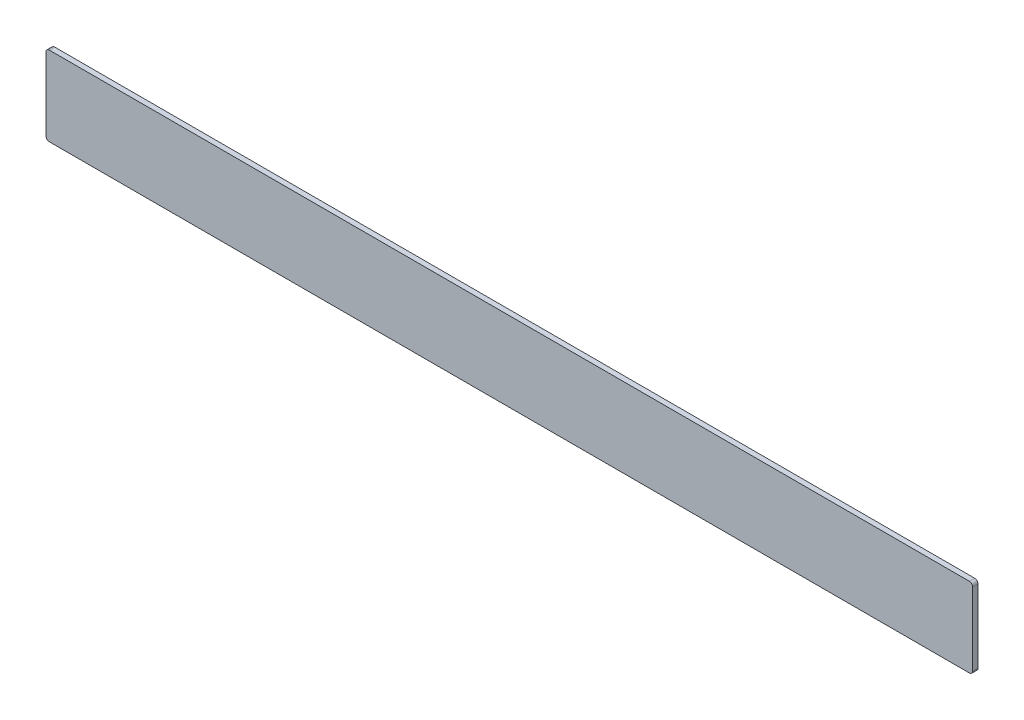
ISO-10303-21;
HEADER;
FILE_DESCRIPTION(('STEP AP214'),'2;1');
FILE_NAME('part.step','',(''),(''),'','','');
FILE_SCHEMA(('AUTOMOTIVE_DESIGN { 1 0 10303 214 1 1 1 1 }'));
ENDSEC;
DATA;
#1=APPLICATION_CONTEXT('core data for automotive mechanical design processes');
#2=APPLICATION_PROTOCOL_DEFINITION('international standard','automotive_design',2000,#1);
#3=PRODUCT_CONTEXT('',#1,'mechanical');
#4=PRODUCT('Part','Part','',(#3));
#5=PRODUCT_RELATED_PRODUCT_CATEGORY('part','',(#4));
#6=PRODUCT_DEFINITION_FORMATION('','',#4);
#7=PRODUCT_DEFINITION_CONTEXT('part definition',#1,'design');
#8=PRODUCT_DEFINITION('design','',#6,#7);
#9=PRODUCT_DEFINITION_SHAPE('','',#8);
#10=(LENGTH_UNIT() NAMED_UNIT(*) SI_UNIT(.MILLI.,.METRE.));
#11=(NAMED_UNIT(*) PLANE_ANGLE_UNIT() SI_UNIT($,.RADIAN.));
#12=(NAMED_UNIT(*) SI_UNIT($,.STERADIAN.) SOLID_ANGLE_UNIT());
#13=UNCERTAINTY_MEASURE_WITH_UNIT(LENGTH_MEASURE(1.E-05),#10,'distance_accuracy_value','');
#14=(GEOMETRIC_REPRESENTATION_CONTEXT(3) GLOBAL_UNCERTAINTY_ASSIGNED_CONTEXT((#13)) GLOBAL_UNIT_ASSIGNED_CONTEXT((#10,
#11,#12)) REPRESENTATION_CONTEXT('',''));
#15=CARTESIAN_POINT('',(0.,0.,0.));
#16=DIRECTION('',(0.,0.,1.));
#17=DIRECTION('',(1.,0.,0.));
#18=AXIS2_PLACEMENT_3D('',#15,#16,#17);
#19=CARTESIAN_POINT('',(-700.,-60.0000000000001,8.));
#20=DIRECTION('',(1.,0.,0.));
#21=DIRECTION('',(0.,0.,-1.));
#22=AXIS2_PLACEMENT_3D('',#19,#20,#21);
#23=PLANE('',#22);
#24=DIRECTION('',(0.,-1.,0.));
#25=VECTOR('',#24,1.);
#26=CARTESIAN_POINT('',(-700.,-60.0000000000001,0.));
#27=LINE('',#26,#25);
#28=CARTESIAN_POINT('',(-700.,54.9999999999999,0.));
#29=VERTEX_POINT('',#28);
#30=CARTESIAN_POINT('',(-700.,-55.0000000000001,0.));
#31=VERTEX_POINT('',#30);
#32=EDGE_CURVE('E127',#29,#31,#27,.T.);
#33=ORIENTED_EDGE('',*,*,#32,.T.);
#34=DIRECTION('',(0.,0.,-1.));
#35=VECTOR('',#34,1.);
#36=CARTESIAN_POINT('',(-700.,-55.0000000000001,8.));
#37=LINE('',#36,#35);
#38=CARTESIAN_POINT('',(-700.,-55.0000000000001,8.));
#39=VERTEX_POINT('',#38);
#40=EDGE_CURVE('E104',#31,#39,#37,.F.);
#41=ORIENTED_EDGE('',*,*,#40,.T.);
#42=DIRECTION('',(0.,-1.,0.));
#43=VECTOR('',#42,1.);
#44=CARTESIAN_POINT('',(-700.,-60.0000000000001,8.));
#45=LINE('',#44,#43);
#46=CARTESIAN_POINT('',(-700.,54.9999999999999,8.));
#47=VERTEX_POINT('',#46);
#48=EDGE_CURVE('E136',#47,#39,#45,.T.);
#49=ORIENTED_EDGE('',*,*,#48,.F.);
#50=DIRECTION('',(0.,0.,-1.));
#51=VECTOR('',#50,1.);
#52=CARTESIAN_POINT('',(-700.,54.9999999999999,8.));
#53=LINE('',#52,#51);
#54=EDGE_CURVE('E109',#47,#29,#53,.T.);
#55=ORIENTED_EDGE('',*,*,#54,.T.);
#56=EDGE_LOOP('',(#33,#41,#49,#55));
#57=FACE_BOUND('',#56,.T.);
#58=ADVANCED_FACE('F32',(#57),#23,.F.);
#59=CARTESIAN_POINT('',(700.,-59.9999999999999,8.));
#60=DIRECTION('',(0.,1.,0.));
#61=DIRECTION('',(-1.,0.,0.));
#62=AXIS2_PLACEMENT_3D('',#59,#60,#61);
#63=PLANE('',#62);
#64=DIRECTION('',(1.,0.,0.));
#65=VECTOR('',#64,1.);
#66=CARTESIAN_POINT('',(700.,-59.9999999999999,8.));
#67=LINE('',#66,#65);
#68=CARTESIAN_POINT('',(-695.,-60.0000000000001,8.));
#69=VERTEX_POINT('',#68);
#70=CARTESIAN_POINT('',(695.,-59.9999999999999,8.));
#71=VERTEX_POINT('',#70);
#72=EDGE_CURVE('E119',#69,#71,#67,.T.);
#73=ORIENTED_EDGE('',*,*,#72,.F.);
#74=DIRECTION('',(0.,0.,-1.));
#75=VECTOR('',#74,1.);
#76=CARTESIAN_POINT('',(-695.,-60.0000000000001,8.));
#77=LINE('',#76,#75);
#78=CARTESIAN_POINT('',(-695.,-60.0000000000001,0.));
#79=VERTEX_POINT('',#78);
#80=EDGE_CURVE('E103',#69,#79,#77,.T.);
#81=ORIENTED_EDGE('',*,*,#80,.T.);
#82=DIRECTION('',(1.,0.,0.));
#83=VECTOR('',#82,1.);
#84=CARTESIAN_POINT('',(700.,-59.9999999999999,0.));
#85=LINE('',#84,#83);
#86=CARTESIAN_POINT('',(695.,-59.9999999999999,0.));
#87=VERTEX_POINT('',#86);
#88=EDGE_CURVE('E116',#79,#87,#85,.T.);
#89=ORIENTED_EDGE('',*,*,#88,.T.);
#90=DIRECTION('',(0.,0.,-1.));
#91=VECTOR('',#90,1.);
#92=CARTESIAN_POINT('',(695.,-59.9999999999999,8.));
#93=LINE('',#92,#91);
#94=EDGE_CURVE('E121',#87,#71,#93,.F.);
#95=ORIENTED_EDGE('',*,*,#94,.T.);
#96=EDGE_LOOP('',(#73,#81,#89,#95));
#97=FACE_BOUND('',#96,.T.);
#98=ADVANCED_FACE('F115',(#97),#63,.F.);
#99=CARTESIAN_POINT('',(700.,-59.9999999999999,8.));
#100=DIRECTION('',(-1.,0.,0.));
#101=DIRECTION('',(0.,0.,1.));
#102=AXIS2_PLACEMENT_3D('',#99,#100,#101);
#103=PLANE('',#102);
#104=DIRECTION('',(0.,1.,0.));
#105=VECTOR('',#104,1.);
#106=CARTESIAN_POINT('',(700.,-59.9999999999999,8.));
#107=LINE('',#106,#105);
#108=CARTESIAN_POINT('',(700.,-54.9999999999999,8.));
#109=VERTEX_POINT('',#108);
#110=CARTESIAN_POINT('',(700.,55.0000000000001,8.));
#111=VERTEX_POINT('',#110);
#112=EDGE_CURVE('E159',#109,#111,#107,.T.);
#113=ORIENTED_EDGE('',*,*,#112,.F.);
#114=DIRECTION('',(0.,0.,-1.));
#115=VECTOR('',#114,1.);
#116=CARTESIAN_POINT('',(700.,-54.9999999999999,8.));
#117=LINE('',#116,#115);
#118=CARTESIAN_POINT('',(700.,-54.9999999999999,0.));
#119=VERTEX_POINT('',#118);
#120=EDGE_CURVE('E11',#109,#119,#117,.T.);
#121=ORIENTED_EDGE('',*,*,#120,.T.);
#122=DIRECTION('',(0.,1.,0.));
#123=VECTOR('',#122,1.);
#124=CARTESIAN_POINT('',(700.,-59.9999999999999,0.));
#125=LINE('',#124,#123);
#126=CARTESIAN_POINT('',(700.,55.0000000000001,0.));
#127=VERTEX_POINT('',#126);
#128=EDGE_CURVE('E126',#119,#127,#125,.T.);
#129=ORIENTED_EDGE('',*,*,#128,.T.);
#130=DIRECTION('',(0.,0.,-1.));
#131=VECTOR('',#130,1.);
#132=CARTESIAN_POINT('',(700.,55.0000000000001,8.));
#133=LINE('',#132,#131);
#134=EDGE_CURVE('E40',#127,#111,#133,.F.);
#135=ORIENTED_EDGE('',*,*,#134,.T.);
#136=EDGE_LOOP('',(#113,#121,#129,#135));
#137=FACE_BOUND('',#136,.T.);
#138=ADVANCED_FACE('F158',(#137),#103,.F.);
#139=CARTESIAN_POINT('',(700.,60.0000000000001,8.));
#140=DIRECTION('',(0.,-1.,0.));
#141=DIRECTION('',(1.,0.,0.));
#142=AXIS2_PLACEMENT_3D('',#139,#140,#141);
#143=PLANE('',#142);
#144=DIRECTION('',(-1.,0.,0.));
#145=VECTOR('',#144,1.);
#146=CARTESIAN_POINT('',(700.,60.0000000000001,0.));
#147=LINE('',#146,#145);
#148=CARTESIAN_POINT('',(695.,60.0000000000001,0.));
#149=VERTEX_POINT('',#148);
#150=CARTESIAN_POINT('',(-695.,59.9999999999999,0.));
#151=VERTEX_POINT('',#150);
#152=EDGE_CURVE('E130',#149,#151,#147,.T.);
#153=ORIENTED_EDGE('',*,*,#152,.T.);
#154=DIRECTION('',(0.,0.,-1.));
#155=VECTOR('',#154,1.);
#156=CARTESIAN_POINT('',(-695.,59.9999999999999,8.));
#157=LINE('',#156,#155);
#158=CARTESIAN_POINT('',(-695.,59.9999999999999,8.));
#159=VERTEX_POINT('',#158);
#160=EDGE_CURVE('E47',#151,#159,#157,.F.);
#161=ORIENTED_EDGE('',*,*,#160,.T.);
#162=DIRECTION('',(-1.,0.,0.));
#163=VECTOR('',#162,1.);
#164=CARTESIAN_POINT('',(700.,60.0000000000001,8.));
#165=LINE('',#164,#163);
#166=CARTESIAN_POINT('',(695.,60.0000000000001,8.));
#167=VERTEX_POINT('',#166);
#168=EDGE_CURVE('E137',#167,#159,#165,.T.);
#169=ORIENTED_EDGE('',*,*,#168,.F.);
#170=DIRECTION('',(0.,0.,-1.));
#171=VECTOR('',#170,1.);
#172=CARTESIAN_POINT('',(695.,60.0000000000001,8.));
#173=LINE('',#172,#171);
#174=EDGE_CURVE('E152',#167,#149,#173,.T.);
#175=ORIENTED_EDGE('',*,*,#174,.T.);
#176=EDGE_LOOP('',(#153,#161,#169,#175));
#177=FACE_BOUND('',#176,.T.);
#178=ADVANCED_FACE('F168',(#177),#143,.F.);
#179=CARTESIAN_POINT('',(0.,0.,8.));
#180=DIRECTION('',(0.,0.,1.));
#181=DIRECTION('',(1.,0.,0.));
#182=AXIS2_PLACEMENT_3D('',#179,#180,#181);
#183=PLANE('',#182);
#184=ORIENTED_EDGE('',*,*,#48,.T.);
#185=CARTESIAN_POINT('',(-695.,-55.0000000000001,8.));
#186=DIRECTION('',(0.,0.,1.));
#187=DIRECTION('',(1.,0.,0.));
#188=AXIS2_PLACEMENT_3D('',#185,#186,#187);
#189=CIRCLE('',#188,5.);
#190=EDGE_CURVE('E150',#39,#69,#189,.T.);
#191=ORIENTED_EDGE('',*,*,#190,.T.);
#192=ORIENTED_EDGE('',*,*,#72,.T.);
#193=CARTESIAN_POINT('',(695.,-54.9999999999999,8.));
#194=DIRECTION('',(0.,0.,1.));
#195=DIRECTION('',(1.,0.,0.));
#196=AXIS2_PLACEMENT_3D('',#193,#194,#195);
#197=CIRCLE('',#196,5.);
#198=EDGE_CURVE('E146',#71,#109,#197,.T.);
#199=ORIENTED_EDGE('',*,*,#198,.T.);
#200=ORIENTED_EDGE('',*,*,#112,.T.);
#201=CARTESIAN_POINT('',(695.,55.0000000000001,8.));
#202=DIRECTION('',(0.,0.,1.));
#203=DIRECTION('',(1.,0.,0.));
#204=AXIS2_PLACEMENT_3D('',#201,#202,#203);
#205=CIRCLE('',#204,5.);
#206=EDGE_CURVE('E54',#111,#167,#205,.T.);
#207=ORIENTED_EDGE('',*,*,#206,.T.);
#208=ORIENTED_EDGE('',*,*,#168,.T.);
#209=CARTESIAN_POINT('',(-695.,54.9999999999999,8.));
#210=DIRECTION('',(0.,0.,1.));
#211=DIRECTION('',(1.,0.,0.));
#212=AXIS2_PLACEMENT_3D('',#209,#210,#211);
#213=CIRCLE('',#212,5.);
#214=EDGE_CURVE('E148',#159,#47,#213,.T.);
#215=ORIENTED_EDGE('',*,*,#214,.T.);
#216=EDGE_LOOP('',(#184,#191,#192,#199,#200,#207,#208,#215));
#217=FACE_BOUND('',#216,.T.);
#218=ADVANCED_FACE('F163',(#217),#183,.T.);
#219=CARTESIAN_POINT('',(0.,0.,0.));
#220=DIRECTION('',(0.,0.,1.));
#221=DIRECTION('',(1.,0.,0.));
#222=AXIS2_PLACEMENT_3D('',#219,#220,#221);
#223=PLANE('',#222);
#224=ORIENTED_EDGE('',*,*,#88,.F.);
#225=CARTESIAN_POINT('',(-695.,-55.0000000000001,0.));
#226=DIRECTION('',(0.,0.,1.));
#227=DIRECTION('',(1.,0.,0.));
#228=AXIS2_PLACEMENT_3D('',#225,#226,#227);
#229=CIRCLE('',#228,5.);
#230=EDGE_CURVE('E99',#79,#31,#229,.F.);
#231=ORIENTED_EDGE('',*,*,#230,.T.);
#232=ORIENTED_EDGE('',*,*,#32,.F.);
#233=CARTESIAN_POINT('',(-695.,54.9999999999999,0.));
#234=DIRECTION('',(0.,0.,1.));
#235=DIRECTION('',(1.,0.,0.));
#236=AXIS2_PLACEMENT_3D('',#233,#234,#235);
#237=CIRCLE('',#236,5.);
#238=EDGE_CURVE('E110',#29,#151,#237,.F.);
#239=ORIENTED_EDGE('',*,*,#238,.T.);
#240=ORIENTED_EDGE('',*,*,#152,.F.);
#241=CARTESIAN_POINT('',(695.,55.0000000000001,0.));
#242=DIRECTION('',(0.,0.,1.));
#243=DIRECTION('',(1.,0.,0.));
#244=AXIS2_PLACEMENT_3D('',#241,#242,#243);
#245=CIRCLE('',#244,5.);
#246=EDGE_CURVE('E120',#149,#127,#245,.F.);
#247=ORIENTED_EDGE('',*,*,#246,.T.);
#248=ORIENTED_EDGE('',*,*,#128,.F.);
#249=CARTESIAN_POINT('',(695.,-54.9999999999999,0.));
#250=DIRECTION('',(0.,0.,1.));
#251=DIRECTION('',(1.,0.,0.));
#252=AXIS2_PLACEMENT_3D('',#249,#250,#251);
#253=CIRCLE('',#252,5.);
#254=EDGE_CURVE('E125',#119,#87,#253,.F.);
#255=ORIENTED_EDGE('',*,*,#254,.T.);
#256=EDGE_LOOP('',(#224,#231,#232,#239,#240,#247,#248,#255));
#257=FACE_BOUND('',#256,.T.);
#258=ADVANCED_FACE('F123',(#257),#223,.F.);
#259=CARTESIAN_POINT('',(-695.,-55.0000000000001,8.));
#260=DIRECTION('',(0.,0.,-1.));
#261=DIRECTION('',(-1.,0.,0.));
#262=AXIS2_PLACEMENT_3D('',#259,#260,#261);
#263=CYLINDRICAL_SURFACE('',#262,5.);
#264=ORIENTED_EDGE('',*,*,#190,.F.);
#265=ORIENTED_EDGE('',*,*,#40,.F.);
#266=ORIENTED_EDGE('',*,*,#230,.F.);
#267=ORIENTED_EDGE('',*,*,#80,.F.);
#268=EDGE_LOOP('',(#264,#265,#266,#267));
#269=FACE_BOUND('',#268,.T.);
#270=ADVANCED_FACE('F102',(#269),#263,.T.);
#271=CARTESIAN_POINT('',(-695.,54.9999999999999,8.));
#272=DIRECTION('',(0.,0.,-1.));
#273=DIRECTION('',(-1.,0.,0.));
#274=AXIS2_PLACEMENT_3D('',#271,#272,#273);
#275=CYLINDRICAL_SURFACE('',#274,5.);
#276=ORIENTED_EDGE('',*,*,#214,.F.);
#277=ORIENTED_EDGE('',*,*,#160,.F.);
#278=ORIENTED_EDGE('',*,*,#238,.F.);
#279=ORIENTED_EDGE('',*,*,#54,.F.);
#280=EDGE_LOOP('',(#276,#277,#278,#279));
#281=FACE_BOUND('',#280,.T.);
#282=ADVANCED_FACE('F172',(#281),#275,.T.);
#283=CARTESIAN_POINT('',(695.,-54.9999999999999,8.));
#284=DIRECTION('',(0.,0.,-1.));
#285=DIRECTION('',(-1.,0.,0.));
#286=AXIS2_PLACEMENT_3D('',#283,#284,#285);
#287=CYLINDRICAL_SURFACE('',#286,5.);
#288=ORIENTED_EDGE('',*,*,#198,.F.);
#289=ORIENTED_EDGE('',*,*,#94,.F.);
#290=ORIENTED_EDGE('',*,*,#254,.F.);
#291=ORIENTED_EDGE('',*,*,#120,.F.);
#292=EDGE_LOOP('',(#288,#289,#290,#291));
#293=FACE_BOUND('',#292,.T.);
#294=ADVANCED_FACE('F178',(#293),#287,.T.);
#295=CARTESIAN_POINT('',(695.,55.0000000000001,8.));
#296=DIRECTION('',(0.,0.,-1.));
#297=DIRECTION('',(-1.,0.,0.));
#298=AXIS2_PLACEMENT_3D('',#295,#296,#297);
#299=CYLINDRICAL_SURFACE('',#298,5.);
#300=ORIENTED_EDGE('',*,*,#206,.F.);
#301=ORIENTED_EDGE('',*,*,#134,.F.);
#302=ORIENTED_EDGE('',*,*,#246,.F.);
#303=ORIENTED_EDGE('',*,*,#174,.F.);
#304=EDGE_LOOP('',(#300,#301,#302,#303));
#305=FACE_BOUND('',#304,.T.);
#306=ADVANCED_FACE('F34',(#305),#299,.T.);
#307=CLOSED_SHELL('',(#58,#98,#138,#178,#218,#258,#270,#282,#294,#306));
#308=MANIFOLD_SOLID_BREP('B2',#307);
#309=ADVANCED_BREP_SHAPE_REPRESENTATION('',(#18,#308),#14);
#310=SHAPE_DEFINITION_REPRESENTATION(#9,#309);
ENDSEC;
END-ISO-10303-21;
